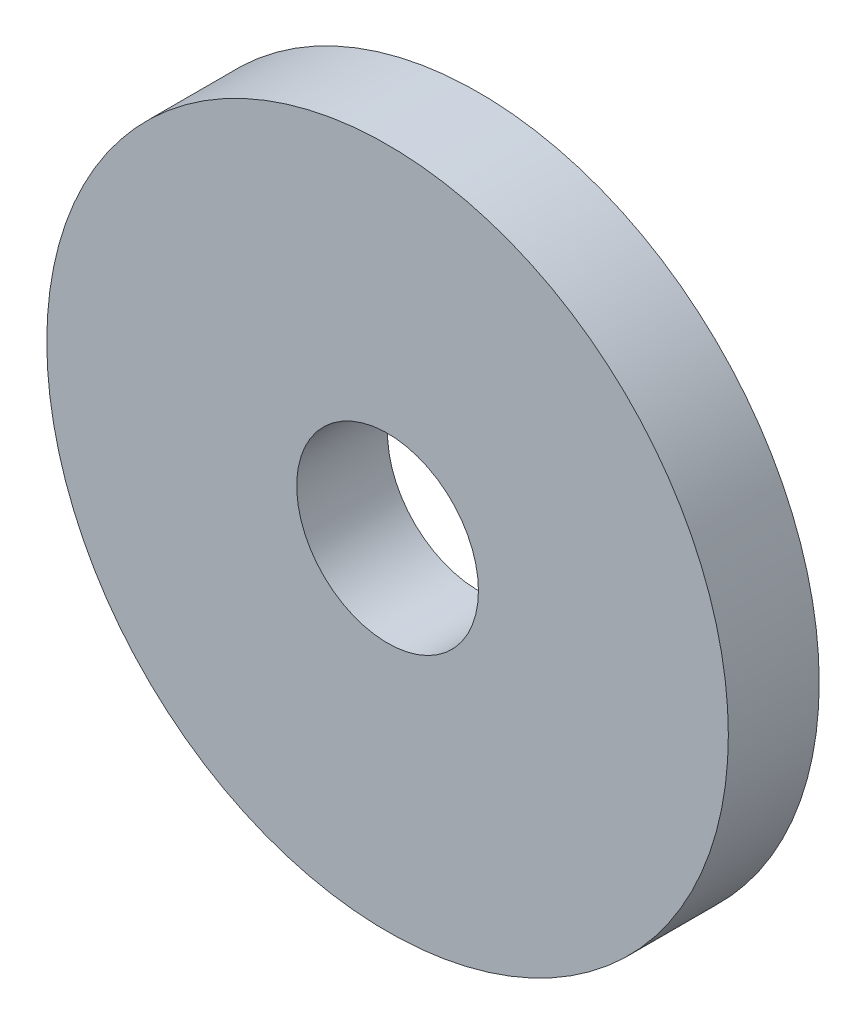
ISO-10303-21;
HEADER;
FILE_DESCRIPTION(('STEP AP214'),'2;1');
FILE_NAME('part.step','',(''),(''),'','','');
FILE_SCHEMA(('AUTOMOTIVE_DESIGN { 1 0 10303 214 1 1 1 1 }'));
ENDSEC;
DATA;
#1=APPLICATION_CONTEXT('core data for automotive mechanical design processes');
#2=APPLICATION_PROTOCOL_DEFINITION('international standard','automotive_design',2000,#1);
#3=PRODUCT_CONTEXT('',#1,'mechanical');
#4=PRODUCT('Part','Part','',(#3));
#5=PRODUCT_RELATED_PRODUCT_CATEGORY('part','',(#4));
#6=PRODUCT_DEFINITION_FORMATION('','',#4);
#7=PRODUCT_DEFINITION_CONTEXT('part definition',#1,'design');
#8=PRODUCT_DEFINITION('design','',#6,#7);
#9=PRODUCT_DEFINITION_SHAPE('','',#8);
#10=(LENGTH_UNIT() NAMED_UNIT(*) SI_UNIT(.MILLI.,.METRE.));
#11=(NAMED_UNIT(*) PLANE_ANGLE_UNIT() SI_UNIT($,.RADIAN.));
#12=(NAMED_UNIT(*) SI_UNIT($,.STERADIAN.) SOLID_ANGLE_UNIT());
#13=UNCERTAINTY_MEASURE_WITH_UNIT(LENGTH_MEASURE(1.E-05),#10,'distance_accuracy_value','');
#14=(GEOMETRIC_REPRESENTATION_CONTEXT(3) GLOBAL_UNCERTAINTY_ASSIGNED_CONTEXT((#13)) GLOBAL_UNIT_ASSIGNED_CONTEXT((#10,
#11,#12)) REPRESENTATION_CONTEXT('',''));
#15=CARTESIAN_POINT('',(0.,0.,0.));
#16=DIRECTION('',(0.,0.,1.));
#17=DIRECTION('',(1.,0.,0.));
#18=AXIS2_PLACEMENT_3D('',#15,#16,#17);
#19=CARTESIAN_POINT('',(0.,0.,2.));
#20=DIRECTION('',(0.,0.,1.));
#21=DIRECTION('',(1.,0.,0.));
#22=AXIS2_PLACEMENT_3D('',#19,#20,#21);
#23=PLANE('',#22);
#24=CARTESIAN_POINT('',(0.,0.,2.));
#25=DIRECTION('',(0.,0.,1.));
#26=DIRECTION('',(1.,0.,0.));
#27=AXIS2_PLACEMENT_3D('',#24,#25,#26);
#28=CIRCLE('',#27,7.5);
#29=CARTESIAN_POINT('',(7.5,0.,2.));
#30=VERTEX_POINT('',#29);
#31=EDGE_CURVE('E10',#30,#30,#28,.T.);
#32=ORIENTED_EDGE('',*,*,#31,.T.);
#33=EDGE_LOOP('',(#32));
#34=FACE_BOUND('',#33,.T.);
#35=CARTESIAN_POINT('',(0.,0.,2.));
#36=DIRECTION('',(0.,0.,1.));
#37=DIRECTION('',(1.,0.,0.));
#38=AXIS2_PLACEMENT_3D('',#35,#36,#37);
#39=CIRCLE('',#38,2.);
#40=CARTESIAN_POINT('',(2.,0.,2.));
#41=VERTEX_POINT('',#40);
#42=EDGE_CURVE('E44',#41,#41,#39,.T.);
#43=ORIENTED_EDGE('',*,*,#42,.F.);
#44=EDGE_LOOP('',(#43));
#45=FACE_BOUND('',#44,.T.);
#46=ADVANCED_FACE('F33',(#34,#45),#23,.T.);
#47=CARTESIAN_POINT('',(0.,0.,0.));
#48=DIRECTION('',(0.,0.,1.));
#49=DIRECTION('',(1.,0.,0.));
#50=AXIS2_PLACEMENT_3D('',#47,#48,#49);
#51=PLANE('',#50);
#52=CARTESIAN_POINT('',(0.,0.,0.));
#53=DIRECTION('',(0.,0.,1.));
#54=DIRECTION('',(1.,0.,0.));
#55=AXIS2_PLACEMENT_3D('',#52,#53,#54);
#56=CIRCLE('',#55,7.5);
#57=CARTESIAN_POINT('',(7.5,0.,0.));
#58=VERTEX_POINT('',#57);
#59=EDGE_CURVE('E37',#58,#58,#56,.T.);
#60=ORIENTED_EDGE('',*,*,#59,.F.);
#61=EDGE_LOOP('',(#60));
#62=FACE_BOUND('',#61,.T.);
#63=CARTESIAN_POINT('',(0.,0.,0.));
#64=DIRECTION('',(0.,0.,1.));
#65=DIRECTION('',(1.,0.,0.));
#66=AXIS2_PLACEMENT_3D('',#63,#64,#65);
#67=CIRCLE('',#66,2.);
#68=CARTESIAN_POINT('',(2.,0.,0.));
#69=VERTEX_POINT('',#68);
#70=EDGE_CURVE('E46',#69,#69,#67,.T.);
#71=ORIENTED_EDGE('',*,*,#70,.T.);
#72=EDGE_LOOP('',(#71));
#73=FACE_BOUND('',#72,.T.);
#74=ADVANCED_FACE('F56',(#62,#73),#51,.F.);
#75=CARTESIAN_POINT('',(0.,0.,2.));
#76=DIRECTION('',(0.,0.,-1.));
#77=DIRECTION('',(-1.,0.,0.));
#78=AXIS2_PLACEMENT_3D('',#75,#76,#77);
#79=CYLINDRICAL_SURFACE('',#78,7.5);
#80=ORIENTED_EDGE('',*,*,#31,.F.);
#81=EDGE_LOOP('',(#80));
#82=FACE_BOUND('',#81,.T.);
#83=ORIENTED_EDGE('',*,*,#59,.T.);
#84=EDGE_LOOP('',(#83));
#85=FACE_BOUND('',#84,.T.);
#86=ADVANCED_FACE('F35',(#82,#85),#79,.T.);
#87=CARTESIAN_POINT('',(0.,0.,2.));
#88=DIRECTION('',(0.,0.,-1.));
#89=DIRECTION('',(-1.,0.,0.));
#90=AXIS2_PLACEMENT_3D('',#87,#88,#89);
#91=CYLINDRICAL_SURFACE('',#90,2.);
#92=ORIENTED_EDGE('',*,*,#42,.T.);
#93=EDGE_LOOP('',(#92));
#94=FACE_BOUND('',#93,.T.);
#95=ORIENTED_EDGE('',*,*,#70,.F.);
#96=EDGE_LOOP('',(#95));
#97=FACE_BOUND('',#96,.T.);
#98=ADVANCED_FACE('F52',(#94,#97),#91,.F.);
#99=CLOSED_SHELL('',(#46,#74,#86,#98));
#100=MANIFOLD_SOLID_BREP('B2',#99);
#101=ADVANCED_BREP_SHAPE_REPRESENTATION('',(#18,#100),#14);
#102=SHAPE_DEFINITION_REPRESENTATION(#9,#101);
ENDSEC;
END-ISO-10303-21;
